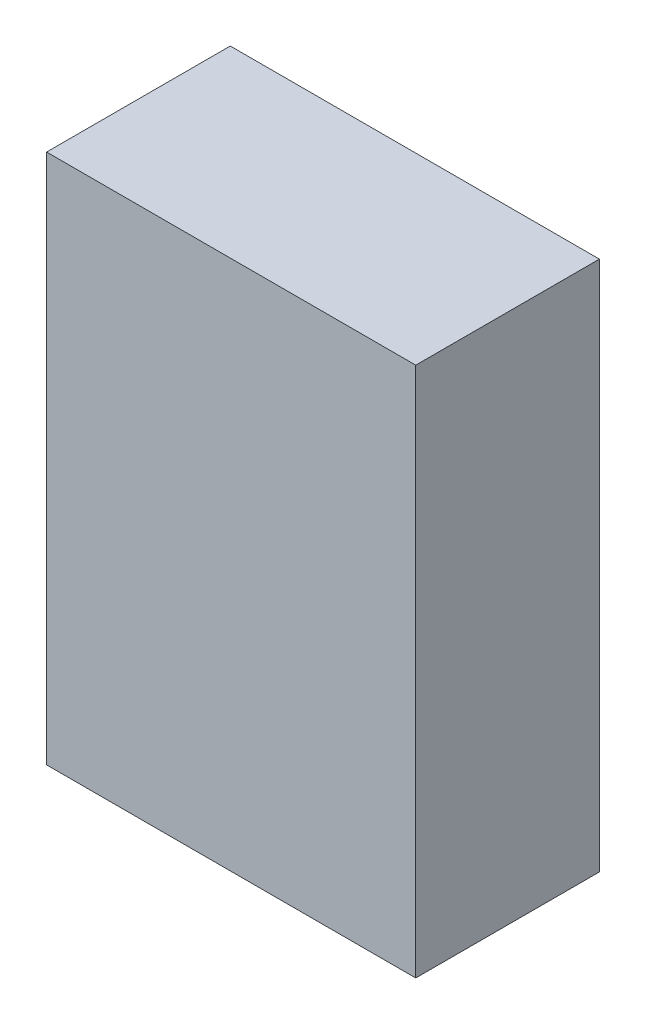
ISO-10303-21;
HEADER;
FILE_DESCRIPTION(('STEP AP214'),'2;1');
FILE_NAME('part.step','',(''),(''),'','','');
FILE_SCHEMA(('AUTOMOTIVE_DESIGN { 1 0 10303 214 1 1 1 1 }'));
ENDSEC;
DATA;
#1=APPLICATION_CONTEXT('core data for automotive mechanical design processes');
#2=APPLICATION_PROTOCOL_DEFINITION('international standard','automotive_design',2000,#1);
#3=PRODUCT_CONTEXT('',#1,'mechanical');
#4=PRODUCT('Part','Part','',(#3));
#5=PRODUCT_RELATED_PRODUCT_CATEGORY('part','',(#4));
#6=PRODUCT_DEFINITION_FORMATION('','',#4);
#7=PRODUCT_DEFINITION_CONTEXT('part definition',#1,'design');
#8=PRODUCT_DEFINITION('design','',#6,#7);
#9=PRODUCT_DEFINITION_SHAPE('','',#8);
#10=(LENGTH_UNIT() NAMED_UNIT(*) SI_UNIT(.MILLI.,.METRE.));
#11=(NAMED_UNIT(*) PLANE_ANGLE_UNIT() SI_UNIT($,.RADIAN.));
#12=(NAMED_UNIT(*) SI_UNIT($,.STERADIAN.) SOLID_ANGLE_UNIT());
#13=UNCERTAINTY_MEASURE_WITH_UNIT(LENGTH_MEASURE(1.E-05),#10,'distance_accuracy_value','');
#14=(GEOMETRIC_REPRESENTATION_CONTEXT(3) GLOBAL_UNCERTAINTY_ASSIGNED_CONTEXT((#13)) GLOBAL_UNIT_ASSIGNED_CONTEXT((#10,
#11,#12)) REPRESENTATION_CONTEXT('',''));
#15=CARTESIAN_POINT('',(0.,0.,0.));
#16=DIRECTION('',(0.,0.,1.));
#17=DIRECTION('',(1.,0.,0.));
#18=AXIS2_PLACEMENT_3D('',#15,#16,#17);
#19=CARTESIAN_POINT('',(0.,0.,1.));
#20=DIRECTION('',(1.,0.,0.));
#21=DIRECTION('',(0.,0.,-1.));
#22=AXIS2_PLACEMENT_3D('',#19,#20,#21);
#23=PLANE('',#22);
#24=DIRECTION('',(0.,-1.,0.));
#25=VECTOR('',#24,1.);
#26=CARTESIAN_POINT('',(0.,0.,0.));
#27=LINE('',#26,#25);
#28=CARTESIAN_POINT('',(0.,2.89,0.));
#29=VERTEX_POINT('',#28);
#30=CARTESIAN_POINT('',(0.,0.,0.));
#31=VERTEX_POINT('',#30);
#32=EDGE_CURVE('E95',#29,#31,#27,.T.);
#33=ORIENTED_EDGE('',*,*,#32,.T.);
#34=DIRECTION('',(0.,0.,-1.));
#35=VECTOR('',#34,1.);
#36=CARTESIAN_POINT('',(0.,0.,1.));
#37=LINE('',#36,#35);
#38=CARTESIAN_POINT('',(0.,0.,1.));
#39=VERTEX_POINT('',#38);
#40=EDGE_CURVE('E11',#39,#31,#37,.T.);
#41=ORIENTED_EDGE('',*,*,#40,.F.);
#42=DIRECTION('',(0.,-1.,0.));
#43=VECTOR('',#42,1.);
#44=CARTESIAN_POINT('',(0.,0.,1.));
#45=LINE('',#44,#43);
#46=CARTESIAN_POINT('',(0.,2.89,1.));
#47=VERTEX_POINT('',#46);
#48=EDGE_CURVE('E83',#47,#39,#45,.T.);
#49=ORIENTED_EDGE('',*,*,#48,.F.);
#50=DIRECTION('',(0.,0.,-1.));
#51=VECTOR('',#50,1.);
#52=CARTESIAN_POINT('',(0.,2.89,1.));
#53=LINE('',#52,#51);
#54=EDGE_CURVE('E91',#47,#29,#53,.T.);
#55=ORIENTED_EDGE('',*,*,#54,.T.);
#56=EDGE_LOOP('',(#33,#41,#49,#55));
#57=FACE_BOUND('',#56,.T.);
#58=ADVANCED_FACE('F32',(#57),#23,.F.);
#59=CARTESIAN_POINT('',(2.01,0.,1.));
#60=DIRECTION('',(0.,1.,0.));
#61=DIRECTION('',(0.,0.,1.));
#62=AXIS2_PLACEMENT_3D('',#59,#60,#61);
#63=PLANE('',#62);
#64=DIRECTION('',(1.,0.,0.));
#65=VECTOR('',#64,1.);
#66=CARTESIAN_POINT('',(2.01,0.,0.));
#67=LINE('',#66,#65);
#68=CARTESIAN_POINT('',(2.01,0.,0.));
#69=VERTEX_POINT('',#68);
#70=EDGE_CURVE('E87',#31,#69,#67,.T.);
#71=ORIENTED_EDGE('',*,*,#70,.T.);
#72=DIRECTION('',(0.,0.,-1.));
#73=VECTOR('',#72,1.);
#74=CARTESIAN_POINT('',(2.01,0.,1.));
#75=LINE('',#74,#73);
#76=CARTESIAN_POINT('',(2.01,0.,1.));
#77=VERTEX_POINT('',#76);
#78=EDGE_CURVE('E40',#77,#69,#75,.T.);
#79=ORIENTED_EDGE('',*,*,#78,.F.);
#80=DIRECTION('',(1.,0.,0.));
#81=VECTOR('',#80,1.);
#82=CARTESIAN_POINT('',(2.01,0.,1.));
#83=LINE('',#82,#81);
#84=EDGE_CURVE('E78',#39,#77,#83,.T.);
#85=ORIENTED_EDGE('',*,*,#84,.F.);
#86=ORIENTED_EDGE('',*,*,#40,.T.);
#87=EDGE_LOOP('',(#71,#79,#85,#86));
#88=FACE_BOUND('',#87,.T.);
#89=ADVANCED_FACE('F86',(#88),#63,.F.);
#90=CARTESIAN_POINT('',(2.01,2.89,1.));
#91=DIRECTION('',(-1.,0.,0.));
#92=DIRECTION('',(0.,0.,1.));
#93=AXIS2_PLACEMENT_3D('',#90,#91,#92);
#94=PLANE('',#93);
#95=DIRECTION('',(0.,1.,0.));
#96=VECTOR('',#95,1.);
#97=CARTESIAN_POINT('',(2.01,2.89,0.));
#98=LINE('',#97,#96);
#99=CARTESIAN_POINT('',(2.01,2.89,0.));
#100=VERTEX_POINT('',#99);
#101=EDGE_CURVE('E65',#69,#100,#98,.T.);
#102=ORIENTED_EDGE('',*,*,#101,.T.);
#103=DIRECTION('',(0.,0.,-1.));
#104=VECTOR('',#103,1.);
#105=CARTESIAN_POINT('',(2.01,2.89,1.));
#106=LINE('',#105,#104);
#107=CARTESIAN_POINT('',(2.01,2.89,1.));
#108=VERTEX_POINT('',#107);
#109=EDGE_CURVE('E88',#108,#100,#106,.T.);
#110=ORIENTED_EDGE('',*,*,#109,.F.);
#111=DIRECTION('',(0.,1.,0.));
#112=VECTOR('',#111,1.);
#113=CARTESIAN_POINT('',(2.01,2.89,1.));
#114=LINE('',#113,#112);
#115=EDGE_CURVE('E81',#77,#108,#114,.T.);
#116=ORIENTED_EDGE('',*,*,#115,.F.);
#117=ORIENTED_EDGE('',*,*,#78,.T.);
#118=EDGE_LOOP('',(#102,#110,#116,#117));
#119=FACE_BOUND('',#118,.T.);
#120=ADVANCED_FACE('F89',(#119),#94,.F.);
#121=CARTESIAN_POINT('',(0.,2.89,1.));
#122=DIRECTION('',(0.,-1.,0.));
#123=DIRECTION('',(0.,0.,-1.));
#124=AXIS2_PLACEMENT_3D('',#121,#122,#123);
#125=PLANE('',#124);
#126=DIRECTION('',(-1.,0.,0.));
#127=VECTOR('',#126,1.);
#128=CARTESIAN_POINT('',(0.,2.89,0.));
#129=LINE('',#128,#127);
#130=EDGE_CURVE('E71',#100,#29,#129,.T.);
#131=ORIENTED_EDGE('',*,*,#130,.T.);
#132=ORIENTED_EDGE('',*,*,#54,.F.);
#133=DIRECTION('',(-1.,0.,0.));
#134=VECTOR('',#133,1.);
#135=CARTESIAN_POINT('',(0.,2.89,1.));
#136=LINE('',#135,#134);
#137=EDGE_CURVE('E48',#108,#47,#136,.T.);
#138=ORIENTED_EDGE('',*,*,#137,.F.);
#139=ORIENTED_EDGE('',*,*,#109,.T.);
#140=EDGE_LOOP('',(#131,#132,#138,#139));
#141=FACE_BOUND('',#140,.T.);
#142=ADVANCED_FACE('F102',(#141),#125,.F.);
#143=CARTESIAN_POINT('',(0.,0.,1.));
#144=DIRECTION('',(0.,0.,-1.));
#145=DIRECTION('',(-1.,0.,0.));
#146=AXIS2_PLACEMENT_3D('',#143,#144,#145);
#147=PLANE('',#146);
#148=ORIENTED_EDGE('',*,*,#48,.T.);
#149=ORIENTED_EDGE('',*,*,#84,.T.);
#150=ORIENTED_EDGE('',*,*,#115,.T.);
#151=ORIENTED_EDGE('',*,*,#137,.T.);
#152=EDGE_LOOP('',(#148,#149,#150,#151));
#153=FACE_BOUND('',#152,.T.);
#154=ADVANCED_FACE('F79',(#153),#147,.F.);
#155=CARTESIAN_POINT('',(0.,0.,0.));
#156=DIRECTION('',(0.,0.,-1.));
#157=DIRECTION('',(-1.,0.,0.));
#158=AXIS2_PLACEMENT_3D('',#155,#156,#157);
#159=PLANE('',#158);
#160=ORIENTED_EDGE('',*,*,#32,.F.);
#161=ORIENTED_EDGE('',*,*,#130,.F.);
#162=ORIENTED_EDGE('',*,*,#101,.F.);
#163=ORIENTED_EDGE('',*,*,#70,.F.);
#164=EDGE_LOOP('',(#160,#161,#162,#163));
#165=FACE_BOUND('',#164,.T.);
#166=ADVANCED_FACE('F105',(#165),#159,.T.);
#167=CLOSED_SHELL('',(#58,#89,#120,#142,#154,#166));
#168=MANIFOLD_SOLID_BREP('B2',#167);
#169=ADVANCED_BREP_SHAPE_REPRESENTATION('',(#18,#168),#14);
#170=SHAPE_DEFINITION_REPRESENTATION(#9,#169);
ENDSEC;
END-ISO-10303-21;
